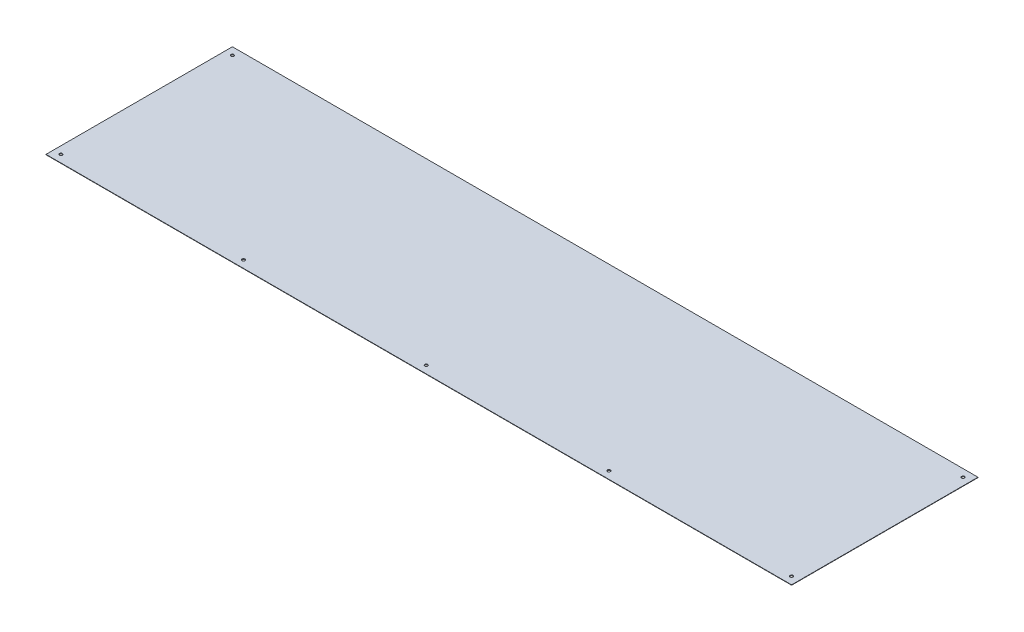
ISO-10303-21;
HEADER;
FILE_DESCRIPTION(('STEP AP214'),'2;1');
FILE_NAME('part.step','',(''),(''),'','','');
FILE_SCHEMA(('AUTOMOTIVE_DESIGN { 1 0 10303 214 1 1 1 1 }'));
ENDSEC;
DATA;
#1=APPLICATION_CONTEXT('core data for automotive mechanical design processes');
#2=APPLICATION_PROTOCOL_DEFINITION('international standard','automotive_design',2000,#1);
#3=PRODUCT_CONTEXT('',#1,'mechanical');
#4=PRODUCT('Part','Part','',(#3));
#5=PRODUCT_RELATED_PRODUCT_CATEGORY('part','',(#4));
#6=PRODUCT_DEFINITION_FORMATION('','',#4);
#7=PRODUCT_DEFINITION_CONTEXT('part definition',#1,'design');
#8=PRODUCT_DEFINITION('design','',#6,#7);
#9=PRODUCT_DEFINITION_SHAPE('','',#8);
#10=(LENGTH_UNIT() NAMED_UNIT(*) SI_UNIT(.MILLI.,.METRE.));
#11=(NAMED_UNIT(*) PLANE_ANGLE_UNIT() SI_UNIT($,.RADIAN.));
#12=(NAMED_UNIT(*) SI_UNIT($,.STERADIAN.) SOLID_ANGLE_UNIT());
#13=UNCERTAINTY_MEASURE_WITH_UNIT(LENGTH_MEASURE(1.E-05),#10,'distance_accuracy_value','');
#14=(GEOMETRIC_REPRESENTATION_CONTEXT(3) GLOBAL_UNCERTAINTY_ASSIGNED_CONTEXT((#13)) GLOBAL_UNIT_ASSIGNED_CONTEXT((#10,
#11,#12)) REPRESENTATION_CONTEXT('',''));
#15=CARTESIAN_POINT('',(0.,0.,0.));
#16=DIRECTION('',(0.,0.,1.));
#17=DIRECTION('',(1.,0.,0.));
#18=AXIS2_PLACEMENT_3D('',#15,#16,#17);
#19=CARTESIAN_POINT('',(0.,1.,0.));
#20=DIRECTION('',(0.,1.,0.));
#21=DIRECTION('',(0.,0.,1.));
#22=AXIS2_PLACEMENT_3D('',#19,#20,#21);
#23=PLANE('',#22);
#24=CARTESIAN_POINT('',(980.,1.,-230.));
#25=DIRECTION('',(0.,1.,0.));
#26=DIRECTION('',(0.,0.,1.));
#27=AXIS2_PLACEMENT_3D('',#24,#25,#26);
#28=CIRCLE('',#27,3.99999999999978);
#29=CARTESIAN_POINT('',(980.,1.,-226.));
#30=VERTEX_POINT('',#29);
#31=EDGE_CURVE('E11',#30,#30,#28,.F.);
#32=ORIENTED_EDGE('',*,*,#31,.T.);
#33=EDGE_LOOP('',(#32));
#34=FACE_BOUND('',#33,.T.);
#35=CARTESIAN_POINT('',(980.,1.,230.));
#36=DIRECTION('',(0.,1.,0.));
#37=DIRECTION('',(0.,0.,1.));
#38=AXIS2_PLACEMENT_3D('',#35,#36,#37);
#39=CIRCLE('',#38,3.99999999999978);
#40=CARTESIAN_POINT('',(980.,1.,234.));
#41=VERTEX_POINT('',#40);
#42=EDGE_CURVE('E49',#41,#41,#39,.F.);
#43=ORIENTED_EDGE('',*,*,#42,.T.);
#44=EDGE_LOOP('',(#43));
#45=FACE_BOUND('',#44,.T.);
#46=CARTESIAN_POINT('',(490.,1.,230.));
#47=DIRECTION('',(0.,1.,0.));
#48=DIRECTION('',(0.,0.,1.));
#49=AXIS2_PLACEMENT_3D('',#46,#47,#48);
#50=CIRCLE('',#49,4.00000000000023);
#51=CARTESIAN_POINT('',(490.,1.,234.));
#52=VERTEX_POINT('',#51);
#53=EDGE_CURVE('E144',#52,#52,#50,.F.);
#54=ORIENTED_EDGE('',*,*,#53,.T.);
#55=EDGE_LOOP('',(#54));
#56=FACE_BOUND('',#55,.T.);
#57=CARTESIAN_POINT('',(2.22044604925031E-13,1.,230.));
#58=DIRECTION('',(0.,1.,0.));
#59=DIRECTION('',(0.,0.,1.));
#60=AXIS2_PLACEMENT_3D('',#57,#58,#59);
#61=CIRCLE('',#60,3.99999999999978);
#62=CARTESIAN_POINT('',(2.22044604925031E-13,1.,234.));
#63=VERTEX_POINT('',#62);
#64=EDGE_CURVE('E140',#63,#63,#61,.F.);
#65=ORIENTED_EDGE('',*,*,#64,.T.);
#66=EDGE_LOOP('',(#65));
#67=FACE_BOUND('',#66,.T.);
#68=CARTESIAN_POINT('',(-490.,1.,230.));
#69=DIRECTION('',(0.,1.,0.));
#70=DIRECTION('',(0.,0.,1.));
#71=AXIS2_PLACEMENT_3D('',#68,#69,#70);
#72=CIRCLE('',#71,4.00000000000023);
#73=CARTESIAN_POINT('',(-490.,1.,234.));
#74=VERTEX_POINT('',#73);
#75=EDGE_CURVE('E136',#74,#74,#72,.F.);
#76=ORIENTED_EDGE('',*,*,#75,.T.);
#77=EDGE_LOOP('',(#76));
#78=FACE_BOUND('',#77,.T.);
#79=CARTESIAN_POINT('',(-980.,1.,230.));
#80=DIRECTION('',(0.,1.,0.));
#81=DIRECTION('',(0.,0.,1.));
#82=AXIS2_PLACEMENT_3D('',#79,#80,#81);
#83=CIRCLE('',#82,3.99999999999978);
#84=CARTESIAN_POINT('',(-980.,1.,234.));
#85=VERTEX_POINT('',#84);
#86=EDGE_CURVE('E132',#85,#85,#83,.F.);
#87=ORIENTED_EDGE('',*,*,#86,.T.);
#88=EDGE_LOOP('',(#87));
#89=FACE_BOUND('',#88,.T.);
#90=CARTESIAN_POINT('',(-980.,1.,-230.));
#91=DIRECTION('',(0.,1.,0.));
#92=DIRECTION('',(0.,0.,1.));
#93=AXIS2_PLACEMENT_3D('',#90,#91,#92);
#94=CIRCLE('',#93,3.99999999999978);
#95=CARTESIAN_POINT('',(-980.,1.,-226.));
#96=VERTEX_POINT('',#95);
#97=EDGE_CURVE('E128',#96,#96,#94,.F.);
#98=ORIENTED_EDGE('',*,*,#97,.T.);
#99=EDGE_LOOP('',(#98));
#100=FACE_BOUND('',#99,.T.);
#101=DIRECTION('',(0.,0.,-1.));
#102=VECTOR('',#101,1.);
#103=CARTESIAN_POINT('',(1000.,1.,-250.));
#104=LINE('',#103,#102);
#105=CARTESIAN_POINT('',(1000.,1.,250.));
#106=VERTEX_POINT('',#105);
#107=CARTESIAN_POINT('',(1000.,1.,-250.));
#108=VERTEX_POINT('',#107);
#109=EDGE_CURVE('E92',#106,#108,#104,.T.);
#110=ORIENTED_EDGE('',*,*,#109,.T.);
#111=DIRECTION('',(-1.,0.,0.));
#112=VECTOR('',#111,1.);
#113=CARTESIAN_POINT('',(-1000.,1.,-250.));
#114=LINE('',#113,#112);
#115=CARTESIAN_POINT('',(-1000.,1.,-250.));
#116=VERTEX_POINT('',#115);
#117=EDGE_CURVE('E88',#108,#116,#114,.T.);
#118=ORIENTED_EDGE('',*,*,#117,.T.);
#119=DIRECTION('',(0.,0.,1.));
#120=VECTOR('',#119,1.);
#121=CARTESIAN_POINT('',(-1000.,1.,-250.));
#122=LINE('',#121,#120);
#123=CARTESIAN_POINT('',(-1000.,1.,250.));
#124=VERTEX_POINT('',#123);
#125=EDGE_CURVE('E90',#116,#124,#122,.T.);
#126=ORIENTED_EDGE('',*,*,#125,.T.);
#127=DIRECTION('',(1.,0.,0.));
#128=VECTOR('',#127,1.);
#129=CARTESIAN_POINT('',(-1000.,1.,250.));
#130=LINE('',#129,#128);
#131=EDGE_CURVE('E57',#124,#106,#130,.T.);
#132=ORIENTED_EDGE('',*,*,#131,.T.);
#133=EDGE_LOOP('',(#110,#118,#126,#132));
#134=FACE_BOUND('',#133,.T.);
#135=ADVANCED_FACE('F39',(#34,#45,#56,#67,#78,#89,#100,#134),#23,.T.);
#136=CARTESIAN_POINT('',(0.,0.,0.));
#137=DIRECTION('',(0.,1.,0.));
#138=DIRECTION('',(0.,0.,1.));
#139=AXIS2_PLACEMENT_3D('',#136,#137,#138);
#140=PLANE('',#139);
#141=DIRECTION('',(0.,0.,-1.));
#142=VECTOR('',#141,1.);
#143=CARTESIAN_POINT('',(1000.,0.,-250.));
#144=LINE('',#143,#142);
#145=CARTESIAN_POINT('',(1000.,0.,250.));
#146=VERTEX_POINT('',#145);
#147=CARTESIAN_POINT('',(1000.,0.,-250.));
#148=VERTEX_POINT('',#147);
#149=EDGE_CURVE('E111',#146,#148,#144,.T.);
#150=ORIENTED_EDGE('',*,*,#149,.F.);
#151=DIRECTION('',(1.,0.,0.));
#152=VECTOR('',#151,1.);
#153=CARTESIAN_POINT('',(-1000.,0.,250.));
#154=LINE('',#153,#152);
#155=CARTESIAN_POINT('',(-1000.,0.,250.));
#156=VERTEX_POINT('',#155);
#157=EDGE_CURVE('E80',#156,#146,#154,.T.);
#158=ORIENTED_EDGE('',*,*,#157,.F.);
#159=DIRECTION('',(0.,0.,1.));
#160=VECTOR('',#159,1.);
#161=CARTESIAN_POINT('',(-1000.,0.,-250.));
#162=LINE('',#161,#160);
#163=CARTESIAN_POINT('',(-1000.,0.,-250.));
#164=VERTEX_POINT('',#163);
#165=EDGE_CURVE('E74',#164,#156,#162,.T.);
#166=ORIENTED_EDGE('',*,*,#165,.F.);
#167=DIRECTION('',(-1.,0.,0.));
#168=VECTOR('',#167,1.);
#169=CARTESIAN_POINT('',(-1000.,0.,-250.));
#170=LINE('',#169,#168);
#171=EDGE_CURVE('E98',#148,#164,#170,.T.);
#172=ORIENTED_EDGE('',*,*,#171,.F.);
#173=EDGE_LOOP('',(#150,#158,#166,#172));
#174=FACE_BOUND('',#173,.T.);
#175=CARTESIAN_POINT('',(980.,0.,-230.));
#176=DIRECTION('',(0.,1.,0.));
#177=DIRECTION('',(0.,0.,1.));
#178=AXIS2_PLACEMENT_3D('',#175,#176,#177);
#179=CIRCLE('',#178,3.00000000000005);
#180=CARTESIAN_POINT('',(980.,0.,-227.));
#181=VERTEX_POINT('',#180);
#182=EDGE_CURVE('E115',#181,#181,#179,.T.);
#183=ORIENTED_EDGE('',*,*,#182,.T.);
#184=EDGE_LOOP('',(#183));
#185=FACE_BOUND('',#184,.T.);
#186=CARTESIAN_POINT('',(-980.,0.,-230.));
#187=DIRECTION('',(0.,1.,0.));
#188=DIRECTION('',(0.,0.,1.));
#189=AXIS2_PLACEMENT_3D('',#186,#187,#188);
#190=CIRCLE('',#189,3.00000000000005);
#191=CARTESIAN_POINT('',(-980.,0.,-227.));
#192=VERTEX_POINT('',#191);
#193=EDGE_CURVE('E170',#192,#192,#190,.T.);
#194=ORIENTED_EDGE('',*,*,#193,.T.);
#195=EDGE_LOOP('',(#194));
#196=FACE_BOUND('',#195,.T.);
#197=CARTESIAN_POINT('',(-980.,0.,230.));
#198=DIRECTION('',(0.,1.,0.));
#199=DIRECTION('',(0.,0.,1.));
#200=AXIS2_PLACEMENT_3D('',#197,#198,#199);
#201=CIRCLE('',#200,3.00000000000005);
#202=CARTESIAN_POINT('',(-980.,0.,233.));
#203=VERTEX_POINT('',#202);
#204=EDGE_CURVE('E164',#203,#203,#201,.T.);
#205=ORIENTED_EDGE('',*,*,#204,.T.);
#206=EDGE_LOOP('',(#205));
#207=FACE_BOUND('',#206,.T.);
#208=CARTESIAN_POINT('',(980.,0.,230.));
#209=DIRECTION('',(0.,1.,0.));
#210=DIRECTION('',(0.,0.,1.));
#211=AXIS2_PLACEMENT_3D('',#208,#209,#210);
#212=CIRCLE('',#211,3.00000000000005);
#213=CARTESIAN_POINT('',(980.,0.,233.));
#214=VERTEX_POINT('',#213);
#215=EDGE_CURVE('E161',#214,#214,#212,.T.);
#216=ORIENTED_EDGE('',*,*,#215,.T.);
#217=EDGE_LOOP('',(#216));
#218=FACE_BOUND('',#217,.T.);
#219=CARTESIAN_POINT('',(2.22044604925031E-13,0.,230.));
#220=DIRECTION('',(0.,1.,0.));
#221=DIRECTION('',(0.,0.,1.));
#222=AXIS2_PLACEMENT_3D('',#219,#220,#221);
#223=CIRCLE('',#222,3.);
#224=CARTESIAN_POINT('',(2.22044604925031E-13,0.,233.));
#225=VERTEX_POINT('',#224);
#226=EDGE_CURVE('E165',#225,#225,#223,.T.);
#227=ORIENTED_EDGE('',*,*,#226,.T.);
#228=EDGE_LOOP('',(#227));
#229=FACE_BOUND('',#228,.T.);
#230=CARTESIAN_POINT('',(-490.,0.,230.));
#231=DIRECTION('',(0.,1.,0.));
#232=DIRECTION('',(0.,0.,1.));
#233=AXIS2_PLACEMENT_3D('',#230,#231,#232);
#234=CIRCLE('',#233,2.99999999999999);
#235=CARTESIAN_POINT('',(-490.,0.,233.));
#236=VERTEX_POINT('',#235);
#237=EDGE_CURVE('E173',#236,#236,#234,.T.);
#238=ORIENTED_EDGE('',*,*,#237,.T.);
#239=EDGE_LOOP('',(#238));
#240=FACE_BOUND('',#239,.T.);
#241=CARTESIAN_POINT('',(490.,0.,230.));
#242=DIRECTION('',(0.,1.,0.));
#243=DIRECTION('',(0.,0.,1.));
#244=AXIS2_PLACEMENT_3D('',#241,#242,#243);
#245=CIRCLE('',#244,2.99999999999999);
#246=CARTESIAN_POINT('',(490.,0.,233.));
#247=VERTEX_POINT('',#246);
#248=EDGE_CURVE('E308',#247,#247,#245,.T.);
#249=ORIENTED_EDGE('',*,*,#248,.T.);
#250=EDGE_LOOP('',(#249));
#251=FACE_BOUND('',#250,.T.);
#252=ADVANCED_FACE('F185',(#174,#185,#196,#207,#218,#229,#240,#251),#140,.F.);
#253=CARTESIAN_POINT('',(1000.,1.,-250.));
#254=DIRECTION('',(-1.,0.,0.));
#255=DIRECTION('',(0.,0.,1.));
#256=AXIS2_PLACEMENT_3D('',#253,#254,#255);
#257=PLANE('',#256);
#258=ORIENTED_EDGE('',*,*,#149,.T.);
#259=DIRECTION('',(0.,-1.,0.));
#260=VECTOR('',#259,1.);
#261=CARTESIAN_POINT('',(1000.,1.,-250.));
#262=LINE('',#261,#260);
#263=EDGE_CURVE('E100',#108,#148,#262,.T.);
#264=ORIENTED_EDGE('',*,*,#263,.F.);
#265=ORIENTED_EDGE('',*,*,#109,.F.);
#266=DIRECTION('',(0.,-1.,0.));
#267=VECTOR('',#266,1.);
#268=CARTESIAN_POINT('',(1000.,1.,250.));
#269=LINE('',#268,#267);
#270=EDGE_CURVE('E107',#106,#146,#269,.T.);
#271=ORIENTED_EDGE('',*,*,#270,.T.);
#272=EDGE_LOOP('',(#258,#264,#265,#271));
#273=FACE_BOUND('',#272,.T.);
#274=ADVANCED_FACE('F204',(#273),#257,.F.);
#275=CARTESIAN_POINT('',(-1000.,1.,-250.));
#276=DIRECTION('',(0.,0.,1.));
#277=DIRECTION('',(1.,0.,0.));
#278=AXIS2_PLACEMENT_3D('',#275,#276,#277);
#279=PLANE('',#278);
#280=ORIENTED_EDGE('',*,*,#171,.T.);
#281=DIRECTION('',(0.,-1.,0.));
#282=VECTOR('',#281,1.);
#283=CARTESIAN_POINT('',(-1000.,1.,-250.));
#284=LINE('',#283,#282);
#285=EDGE_CURVE('E96',#116,#164,#284,.T.);
#286=ORIENTED_EDGE('',*,*,#285,.F.);
#287=ORIENTED_EDGE('',*,*,#117,.F.);
#288=ORIENTED_EDGE('',*,*,#263,.T.);
#289=EDGE_LOOP('',(#280,#286,#287,#288));
#290=FACE_BOUND('',#289,.T.);
#291=ADVANCED_FACE('F97',(#290),#279,.F.);
#292=CARTESIAN_POINT('',(-1000.,1.,-250.));
#293=DIRECTION('',(1.,0.,0.));
#294=DIRECTION('',(0.,0.,-1.));
#295=AXIS2_PLACEMENT_3D('',#292,#293,#294);
#296=PLANE('',#295);
#297=ORIENTED_EDGE('',*,*,#165,.T.);
#298=DIRECTION('',(0.,-1.,0.));
#299=VECTOR('',#298,1.);
#300=CARTESIAN_POINT('',(-1000.,1.,250.));
#301=LINE('',#300,#299);
#302=EDGE_CURVE('E101',#124,#156,#301,.T.);
#303=ORIENTED_EDGE('',*,*,#302,.F.);
#304=ORIENTED_EDGE('',*,*,#125,.F.);
#305=ORIENTED_EDGE('',*,*,#285,.T.);
#306=EDGE_LOOP('',(#297,#303,#304,#305));
#307=FACE_BOUND('',#306,.T.);
#308=ADVANCED_FACE('F103',(#307),#296,.F.);
#309=CARTESIAN_POINT('',(-1000.,1.,250.));
#310=DIRECTION('',(0.,0.,-1.));
#311=DIRECTION('',(-1.,0.,0.));
#312=AXIS2_PLACEMENT_3D('',#309,#310,#311);
#313=PLANE('',#312);
#314=ORIENTED_EDGE('',*,*,#157,.T.);
#315=ORIENTED_EDGE('',*,*,#270,.F.);
#316=ORIENTED_EDGE('',*,*,#131,.F.);
#317=ORIENTED_EDGE('',*,*,#302,.T.);
#318=EDGE_LOOP('',(#314,#315,#316,#317));
#319=FACE_BOUND('',#318,.T.);
#320=ADVANCED_FACE('F189',(#319),#313,.F.);
#321=CARTESIAN_POINT('',(980.,0.,-230.));
#322=DIRECTION('',(0.,1.,0.));
#323=DIRECTION('',(0.,0.,1.));
#324=AXIS2_PLACEMENT_3D('',#321,#322,#323);
#325=CONICAL_SURFACE('',#324,3.00000000000005,0.785398163397332);
#326=ORIENTED_EDGE('',*,*,#31,.F.);
#327=EDGE_LOOP('',(#326));
#328=FACE_BOUND('',#327,.T.);
#329=ORIENTED_EDGE('',*,*,#182,.F.);
#330=EDGE_LOOP('',(#329));
#331=FACE_BOUND('',#330,.T.);
#332=ADVANCED_FACE('F157',(#328,#331),#325,.F.);
#333=CARTESIAN_POINT('',(980.,0.,230.));
#334=DIRECTION('',(0.,1.,0.));
#335=DIRECTION('',(0.,0.,1.));
#336=AXIS2_PLACEMENT_3D('',#333,#334,#335);
#337=CONICAL_SURFACE('',#336,3.00000000000005,0.785398163397332);
#338=ORIENTED_EDGE('',*,*,#42,.F.);
#339=EDGE_LOOP('',(#338));
#340=FACE_BOUND('',#339,.T.);
#341=ORIENTED_EDGE('',*,*,#215,.F.);
#342=EDGE_LOOP('',(#341));
#343=FACE_BOUND('',#342,.T.);
#344=ADVANCED_FACE('F153',(#340,#343),#337,.F.);
#345=CARTESIAN_POINT('',(490.,-2.4156024402977E-13,230.));
#346=DIRECTION('',(0.,1.,0.));
#347=DIRECTION('',(0.,0.,1.));
#348=AXIS2_PLACEMENT_3D('',#345,#346,#347);
#349=CONICAL_SURFACE('',#348,2.99999999999999,0.785398163397443);
#350=ORIENTED_EDGE('',*,*,#53,.F.);
#351=EDGE_LOOP('',(#350));
#352=FACE_BOUND('',#351,.T.);
#353=ORIENTED_EDGE('',*,*,#248,.F.);
#354=EDGE_LOOP('',(#353));
#355=FACE_BOUND('',#354,.T.);
#356=ADVANCED_FACE('F156',(#352,#355),#349,.F.);
#357=CARTESIAN_POINT('',(2.22044604925031E-13,0.,230.));
#358=DIRECTION('',(0.,1.,0.));
#359=DIRECTION('',(0.,0.,1.));
#360=AXIS2_PLACEMENT_3D('',#357,#358,#359);
#361=CONICAL_SURFACE('',#360,3.,0.785398163397332);
#362=ORIENTED_EDGE('',*,*,#64,.F.);
#363=EDGE_LOOP('',(#362));
#364=FACE_BOUND('',#363,.T.);
#365=ORIENTED_EDGE('',*,*,#226,.F.);
#366=EDGE_LOOP('',(#365));
#367=FACE_BOUND('',#366,.T.);
#368=ADVANCED_FACE('F254',(#364,#367),#361,.F.);
#369=CARTESIAN_POINT('',(-490.,-2.4156024402977E-13,230.));
#370=DIRECTION('',(0.,1.,0.));
#371=DIRECTION('',(0.,0.,1.));
#372=AXIS2_PLACEMENT_3D('',#369,#370,#371);
#373=CONICAL_SURFACE('',#372,2.99999999999999,0.785398163397443);
#374=ORIENTED_EDGE('',*,*,#75,.F.);
#375=EDGE_LOOP('',(#374));
#376=FACE_BOUND('',#375,.T.);
#377=ORIENTED_EDGE('',*,*,#237,.F.);
#378=EDGE_LOOP('',(#377));
#379=FACE_BOUND('',#378,.T.);
#380=ADVANCED_FACE('F264',(#376,#379),#373,.F.);
#381=CARTESIAN_POINT('',(-980.,0.,230.));
#382=DIRECTION('',(0.,1.,0.));
#383=DIRECTION('',(0.,0.,1.));
#384=AXIS2_PLACEMENT_3D('',#381,#382,#383);
#385=CONICAL_SURFACE('',#384,3.00000000000005,0.785398163397332);
#386=ORIENTED_EDGE('',*,*,#86,.F.);
#387=EDGE_LOOP('',(#386));
#388=FACE_BOUND('',#387,.T.);
#389=ORIENTED_EDGE('',*,*,#204,.F.);
#390=EDGE_LOOP('',(#389));
#391=FACE_BOUND('',#390,.T.);
#392=ADVANCED_FACE('F274',(#388,#391),#385,.F.);
#393=CARTESIAN_POINT('',(-980.,0.,-230.));
#394=DIRECTION('',(0.,1.,0.));
#395=DIRECTION('',(0.,0.,1.));
#396=AXIS2_PLACEMENT_3D('',#393,#394,#395);
#397=CONICAL_SURFACE('',#396,3.00000000000005,0.785398163397332);
#398=ORIENTED_EDGE('',*,*,#97,.F.);
#399=EDGE_LOOP('',(#398));
#400=FACE_BOUND('',#399,.T.);
#401=ORIENTED_EDGE('',*,*,#193,.F.);
#402=EDGE_LOOP('',(#401));
#403=FACE_BOUND('',#402,.T.);
#404=ADVANCED_FACE('F41',(#400,#403),#397,.F.);
#405=CLOSED_SHELL('',(#135,#252,#274,#291,#308,#320,#332,#344,#356,#368,#380,#392,#404));
#406=MANIFOLD_SOLID_BREP('B2',#405);
#407=ADVANCED_BREP_SHAPE_REPRESENTATION('',(#18,#406),#14);
#408=SHAPE_DEFINITION_REPRESENTATION(#9,#407);
ENDSEC;
END-ISO-10303-21;
